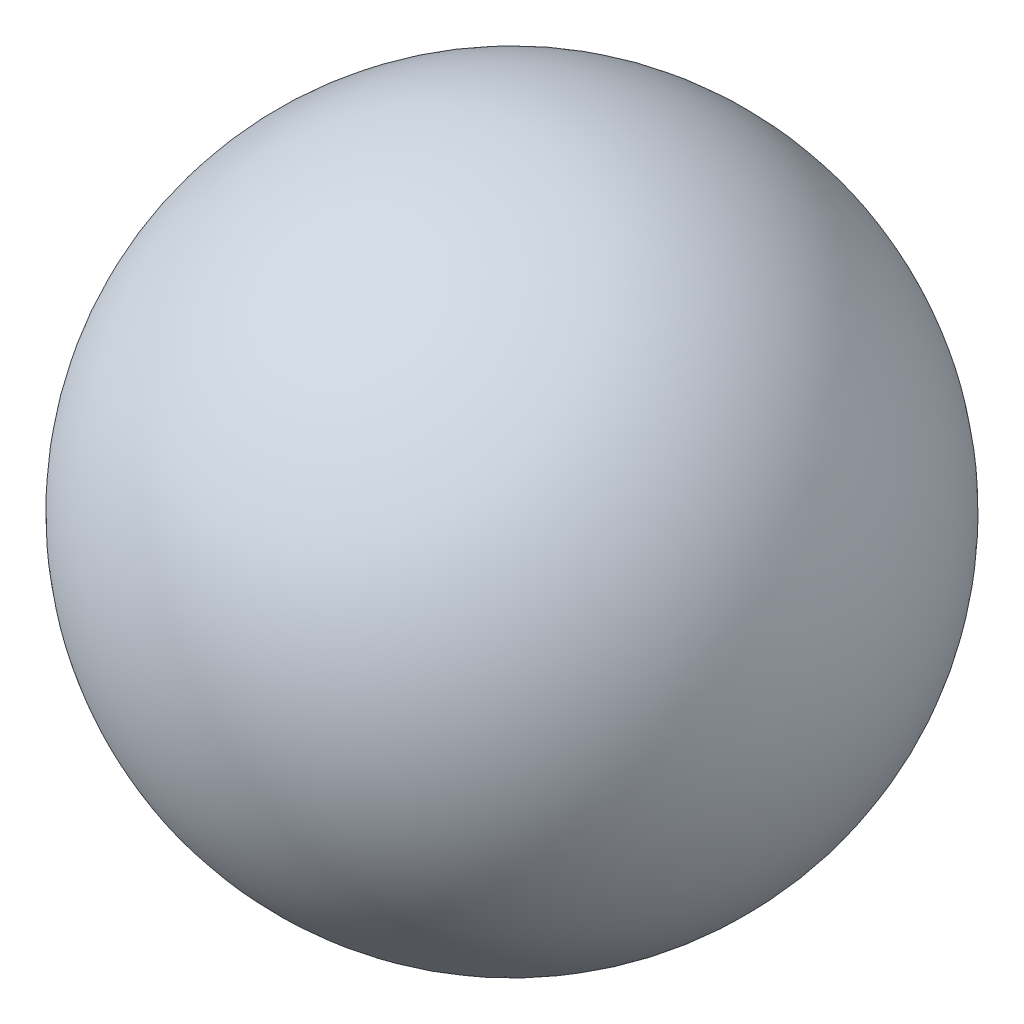
ISO-10303-21;
HEADER;
FILE_DESCRIPTION(('STEP AP214'),'2;1');
FILE_NAME('part.step','',(''),(''),'','','');
FILE_SCHEMA(('AUTOMOTIVE_DESIGN { 1 0 10303 214 1 1 1 1 }'));
ENDSEC;
DATA;
#1=APPLICATION_CONTEXT('core data for automotive mechanical design processes');
#2=APPLICATION_PROTOCOL_DEFINITION('international standard','automotive_design',2000,#1);
#3=PRODUCT_CONTEXT('',#1,'mechanical');
#4=PRODUCT('Part','Part','',(#3));
#5=PRODUCT_RELATED_PRODUCT_CATEGORY('part','',(#4));
#6=PRODUCT_DEFINITION_FORMATION('','',#4);
#7=PRODUCT_DEFINITION_CONTEXT('part definition',#1,'design');
#8=PRODUCT_DEFINITION('design','',#6,#7);
#9=PRODUCT_DEFINITION_SHAPE('','',#8);
#10=(LENGTH_UNIT() NAMED_UNIT(*) SI_UNIT(.MILLI.,.METRE.));
#11=(NAMED_UNIT(*) PLANE_ANGLE_UNIT() SI_UNIT($,.RADIAN.));
#12=(NAMED_UNIT(*) SI_UNIT($,.STERADIAN.) SOLID_ANGLE_UNIT());
#13=UNCERTAINTY_MEASURE_WITH_UNIT(LENGTH_MEASURE(1.E-05),#10,'distance_accuracy_value','');
#14=(GEOMETRIC_REPRESENTATION_CONTEXT(3) GLOBAL_UNCERTAINTY_ASSIGNED_CONTEXT((#13)) GLOBAL_UNIT_ASSIGNED_CONTEXT((#10,
#11,#12)) REPRESENTATION_CONTEXT('',''));
#15=CARTESIAN_POINT('',(0.,0.,0.));
#16=DIRECTION('',(0.,0.,1.));
#17=DIRECTION('',(1.,0.,0.));
#18=AXIS2_PLACEMENT_3D('',#15,#16,#17);
#19=CARTESIAN_POINT('',(0.,0.,0.));
#20=DIRECTION('',(0.,0.,-1.));
#21=DIRECTION('',(1.,0.,0.));
#22=AXIS2_PLACEMENT_3D('',#19,#20,#21);
#23=SPHERICAL_SURFACE('',#22,15.);
#24=CARTESIAN_POINT('',(0.,0.,-15.));
#25=VERTEX_POINT('',#24);
#26=VERTEX_LOOP('',#25);
#27=FACE_BOUND('',#26,.T.);
#28=ADVANCED_FACE('F39',(#27),#23,.T.);
#29=CLOSED_SHELL('',(#28));
#30=MANIFOLD_SOLID_BREP('B2',#29);
#31=ADVANCED_BREP_SHAPE_REPRESENTATION('',(#18,#30),#14);
#32=SHAPE_DEFINITION_REPRESENTATION(#9,#31);
ENDSEC;
END-ISO-10303-21;
